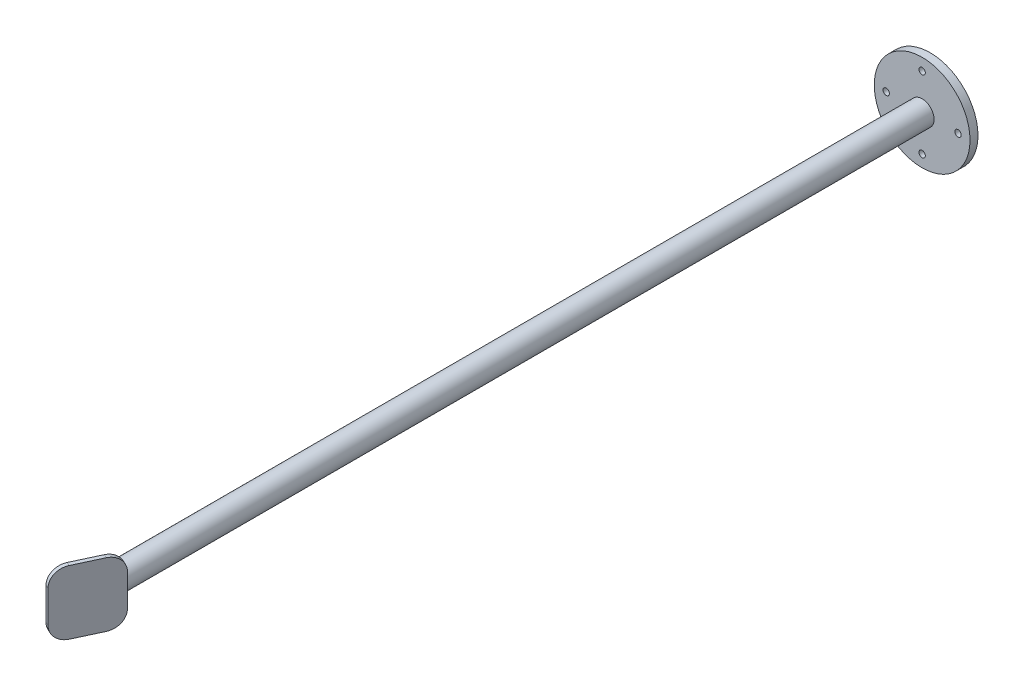
ISO-10303-21;
HEADER;
FILE_DESCRIPTION(('STEP AP214'),'2;1');
FILE_NAME('part.step','',(''),(''),'','','');
FILE_SCHEMA(('AUTOMOTIVE_DESIGN { 1 0 10303 214 1 1 1 1 }'));
ENDSEC;
DATA;
#1=APPLICATION_CONTEXT('core data for automotive mechanical design processes');
#2=APPLICATION_PROTOCOL_DEFINITION('international standard','automotive_design',2000,#1);
#3=PRODUCT_CONTEXT('',#1,'mechanical');
#4=PRODUCT('Part','Part','',(#3));
#5=PRODUCT_RELATED_PRODUCT_CATEGORY('part','',(#4));
#6=PRODUCT_DEFINITION_FORMATION('','',#4);
#7=PRODUCT_DEFINITION_CONTEXT('part definition',#1,'design');
#8=PRODUCT_DEFINITION('design','',#6,#7);
#9=PRODUCT_DEFINITION_SHAPE('','',#8);
#10=(LENGTH_UNIT() NAMED_UNIT(*) SI_UNIT(.MILLI.,.METRE.));
#11=(NAMED_UNIT(*) PLANE_ANGLE_UNIT() SI_UNIT($,.RADIAN.));
#12=(NAMED_UNIT(*) SI_UNIT($,.STERADIAN.) SOLID_ANGLE_UNIT());
#13=UNCERTAINTY_MEASURE_WITH_UNIT(LENGTH_MEASURE(1.E-05),#10,'distance_accuracy_value','');
#14=(GEOMETRIC_REPRESENTATION_CONTEXT(3) GLOBAL_UNCERTAINTY_ASSIGNED_CONTEXT((#13)) GLOBAL_UNIT_ASSIGNED_CONTEXT((#10,
#11,#12)) REPRESENTATION_CONTEXT('',''));
#15=CARTESIAN_POINT('',(0.,0.,0.));
#16=DIRECTION('',(0.,0.,1.));
#17=DIRECTION('',(1.,0.,0.));
#18=AXIS2_PLACEMENT_3D('',#15,#16,#17);
#19=CARTESIAN_POINT('',(0.,0.,10.));
#20=DIRECTION('',(0.,0.,1.));
#21=DIRECTION('',(1.,0.,0.));
#22=AXIS2_PLACEMENT_3D('',#19,#20,#21);
#23=PLANE('',#22);
#24=CARTESIAN_POINT('',(0.,0.,10.));
#25=DIRECTION('',(0.,0.,1.));
#26=DIRECTION('',(1.,0.,0.));
#27=AXIS2_PLACEMENT_3D('',#24,#25,#26);
#28=CIRCLE('',#27,15.);
#29=CARTESIAN_POINT('',(15.,0.,10.));
#30=VERTEX_POINT('',#29);
#31=EDGE_CURVE('E163',#30,#30,#28,.T.);
#32=ORIENTED_EDGE('',*,*,#31,.F.);
#33=EDGE_LOOP('',(#32));
#34=FACE_BOUND('',#33,.T.);
#35=CARTESIAN_POINT('',(0.,-45.,10.));
#36=DIRECTION('',(0.,0.,1.));
#37=DIRECTION('',(1.,0.,0.));
#38=AXIS2_PLACEMENT_3D('',#35,#36,#37);
#39=CIRCLE('',#38,4.);
#40=CARTESIAN_POINT('',(4.00000000000001,-45.,10.));
#41=VERTEX_POINT('',#40);
#42=EDGE_CURVE('E173',#41,#41,#39,.T.);
#43=ORIENTED_EDGE('',*,*,#42,.F.);
#44=EDGE_LOOP('',(#43));
#45=FACE_BOUND('',#44,.T.);
#46=CARTESIAN_POINT('',(0.,45.,10.));
#47=DIRECTION('',(0.,0.,1.));
#48=DIRECTION('',(1.,0.,0.));
#49=AXIS2_PLACEMENT_3D('',#46,#47,#48);
#50=CIRCLE('',#49,4.);
#51=CARTESIAN_POINT('',(4.,45.,10.));
#52=VERTEX_POINT('',#51);
#53=EDGE_CURVE('E185',#52,#52,#50,.T.);
#54=ORIENTED_EDGE('',*,*,#53,.F.);
#55=EDGE_LOOP('',(#54));
#56=FACE_BOUND('',#55,.T.);
#57=CARTESIAN_POINT('',(0.,0.,10.));
#58=DIRECTION('',(0.,0.,1.));
#59=DIRECTION('',(1.,0.,0.));
#60=AXIS2_PLACEMENT_3D('',#57,#58,#59);
#61=CIRCLE('',#60,60.);
#62=CARTESIAN_POINT('',(60.,0.,10.));
#63=VERTEX_POINT('',#62);
#64=EDGE_CURVE('E11',#63,#63,#61,.T.);
#65=ORIENTED_EDGE('',*,*,#64,.T.);
#66=EDGE_LOOP('',(#65));
#67=FACE_BOUND('',#66,.T.);
#68=CARTESIAN_POINT('',(45.,0.,10.));
#69=DIRECTION('',(0.,0.,1.));
#70=DIRECTION('',(1.,0.,0.));
#71=AXIS2_PLACEMENT_3D('',#68,#69,#70);
#72=CIRCLE('',#71,4.00000000000001);
#73=CARTESIAN_POINT('',(49.,0.,10.));
#74=VERTEX_POINT('',#73);
#75=EDGE_CURVE('E179',#74,#74,#72,.T.);
#76=ORIENTED_EDGE('',*,*,#75,.F.);
#77=EDGE_LOOP('',(#76));
#78=FACE_BOUND('',#77,.T.);
#79=CARTESIAN_POINT('',(-45.,0.,10.));
#80=DIRECTION('',(0.,0.,1.));
#81=DIRECTION('',(1.,0.,0.));
#82=AXIS2_PLACEMENT_3D('',#79,#80,#81);
#83=CIRCLE('',#82,4.00000000000001);
#84=CARTESIAN_POINT('',(-41.,0.,10.));
#85=VERTEX_POINT('',#84);
#86=EDGE_CURVE('E167',#85,#85,#83,.T.);
#87=ORIENTED_EDGE('',*,*,#86,.F.);
#88=EDGE_LOOP('',(#87));
#89=FACE_BOUND('',#88,.T.);
#90=ADVANCED_FACE('F33',(#34,#45,#56,#67,#78,#89),#23,.T.);
#91=CARTESIAN_POINT('',(0.,0.,0.));
#92=DIRECTION('',(0.,0.,1.));
#93=DIRECTION('',(1.,0.,0.));
#94=AXIS2_PLACEMENT_3D('',#91,#92,#93);
#95=PLANE('',#94);
#96=CARTESIAN_POINT('',(0.,0.,0.));
#97=DIRECTION('',(0.,0.,1.));
#98=DIRECTION('',(1.,0.,0.));
#99=AXIS2_PLACEMENT_3D('',#96,#97,#98);
#100=CIRCLE('',#99,60.);
#101=CARTESIAN_POINT('',(60.,0.,0.));
#102=VERTEX_POINT('',#101);
#103=EDGE_CURVE('E37',#102,#102,#100,.T.);
#104=ORIENTED_EDGE('',*,*,#103,.F.);
#105=EDGE_LOOP('',(#104));
#106=FACE_BOUND('',#105,.T.);
#107=CARTESIAN_POINT('',(0.,45.,0.));
#108=DIRECTION('',(0.,0.,1.));
#109=DIRECTION('',(1.,0.,0.));
#110=AXIS2_PLACEMENT_3D('',#107,#108,#109);
#111=CIRCLE('',#110,4.);
#112=CARTESIAN_POINT('',(4.,45.,0.));
#113=VERTEX_POINT('',#112);
#114=EDGE_CURVE('E182',#113,#113,#111,.T.);
#115=ORIENTED_EDGE('',*,*,#114,.T.);
#116=EDGE_LOOP('',(#115));
#117=FACE_BOUND('',#116,.T.);
#118=CARTESIAN_POINT('',(45.,0.,0.));
#119=DIRECTION('',(0.,0.,1.));
#120=DIRECTION('',(1.,0.,0.));
#121=AXIS2_PLACEMENT_3D('',#118,#119,#120);
#122=CIRCLE('',#121,4.00000000000001);
#123=CARTESIAN_POINT('',(49.,0.,0.));
#124=VERTEX_POINT('',#123);
#125=EDGE_CURVE('E176',#124,#124,#122,.T.);
#126=ORIENTED_EDGE('',*,*,#125,.T.);
#127=EDGE_LOOP('',(#126));
#128=FACE_BOUND('',#127,.T.);
#129=CARTESIAN_POINT('',(0.,-45.,0.));
#130=DIRECTION('',(0.,0.,1.));
#131=DIRECTION('',(1.,0.,0.));
#132=AXIS2_PLACEMENT_3D('',#129,#130,#131);
#133=CIRCLE('',#132,4.);
#134=CARTESIAN_POINT('',(4.00000000000001,-45.,0.));
#135=VERTEX_POINT('',#134);
#136=EDGE_CURVE('E170',#135,#135,#133,.T.);
#137=ORIENTED_EDGE('',*,*,#136,.T.);
#138=EDGE_LOOP('',(#137));
#139=FACE_BOUND('',#138,.T.);
#140=CARTESIAN_POINT('',(-45.,0.,0.));
#141=DIRECTION('',(0.,0.,1.));
#142=DIRECTION('',(1.,0.,0.));
#143=AXIS2_PLACEMENT_3D('',#140,#141,#142);
#144=CIRCLE('',#143,4.00000000000001);
#145=CARTESIAN_POINT('',(-41.,0.,0.));
#146=VERTEX_POINT('',#145);
#147=EDGE_CURVE('E166',#146,#146,#144,.T.);
#148=ORIENTED_EDGE('',*,*,#147,.T.);
#149=EDGE_LOOP('',(#148));
#150=FACE_BOUND('',#149,.T.);
#151=ADVANCED_FACE('F191',(#106,#117,#128,#139,#150),#95,.F.);
#152=CARTESIAN_POINT('',(0.,0.,10.));
#153=DIRECTION('',(0.,0.,-1.));
#154=DIRECTION('',(-1.,0.,0.));
#155=AXIS2_PLACEMENT_3D('',#152,#153,#154);
#156=CYLINDRICAL_SURFACE('',#155,60.);
#157=ORIENTED_EDGE('',*,*,#64,.F.);
#158=EDGE_LOOP('',(#157));
#159=FACE_BOUND('',#158,.T.);
#160=ORIENTED_EDGE('',*,*,#103,.T.);
#161=EDGE_LOOP('',(#160));
#162=FACE_BOUND('',#161,.T.);
#163=ADVANCED_FACE('F35',(#159,#162),#156,.T.);
#164=CARTESIAN_POINT('',(0.,45.,10.));
#165=DIRECTION('',(0.,0.,-1.));
#166=DIRECTION('',(-1.,0.,0.));
#167=AXIS2_PLACEMENT_3D('',#164,#165,#166);
#168=CYLINDRICAL_SURFACE('',#167,4.);
#169=ORIENTED_EDGE('',*,*,#53,.T.);
#170=EDGE_LOOP('',(#169));
#171=FACE_BOUND('',#170,.T.);
#172=ORIENTED_EDGE('',*,*,#114,.F.);
#173=EDGE_LOOP('',(#172));
#174=FACE_BOUND('',#173,.T.);
#175=ADVANCED_FACE('F194',(#171,#174),#168,.F.);
#176=CARTESIAN_POINT('',(45.,0.,10.));
#177=DIRECTION('',(0.,0.,-1.));
#178=DIRECTION('',(-1.,0.,0.));
#179=AXIS2_PLACEMENT_3D('',#176,#177,#178);
#180=CYLINDRICAL_SURFACE('',#179,4.00000000000001);
#181=ORIENTED_EDGE('',*,*,#75,.T.);
#182=EDGE_LOOP('',(#181));
#183=FACE_BOUND('',#182,.T.);
#184=ORIENTED_EDGE('',*,*,#125,.F.);
#185=EDGE_LOOP('',(#184));
#186=FACE_BOUND('',#185,.T.);
#187=ADVANCED_FACE('F196',(#183,#186),#180,.F.);
#188=CARTESIAN_POINT('',(0.,-45.,10.));
#189=DIRECTION('',(0.,0.,-1.));
#190=DIRECTION('',(-1.,0.,0.));
#191=AXIS2_PLACEMENT_3D('',#188,#189,#190);
#192=CYLINDRICAL_SURFACE('',#191,4.);
#193=ORIENTED_EDGE('',*,*,#42,.T.);
#194=EDGE_LOOP('',(#193));
#195=FACE_BOUND('',#194,.T.);
#196=ORIENTED_EDGE('',*,*,#136,.F.);
#197=EDGE_LOOP('',(#196));
#198=FACE_BOUND('',#197,.T.);
#199=ADVANCED_FACE('F203',(#195,#198),#192,.F.);
#200=CARTESIAN_POINT('',(-45.,0.,10.));
#201=DIRECTION('',(0.,0.,-1.));
#202=DIRECTION('',(-1.,0.,0.));
#203=AXIS2_PLACEMENT_3D('',#200,#201,#202);
#204=CYLINDRICAL_SURFACE('',#203,4.00000000000001);
#205=ORIENTED_EDGE('',*,*,#86,.T.);
#206=EDGE_LOOP('',(#205));
#207=FACE_BOUND('',#206,.T.);
#208=ORIENTED_EDGE('',*,*,#147,.F.);
#209=EDGE_LOOP('',(#208));
#210=FACE_BOUND('',#209,.T.);
#211=ADVANCED_FACE('F226',(#207,#210),#204,.F.);
#212=CARTESIAN_POINT('',(0.,0.,1090.));
#213=DIRECTION('',(0.,0.,-1.));
#214=DIRECTION('',(-1.,0.,0.));
#215=AXIS2_PLACEMENT_3D('',#212,#213,#214);
#216=CYLINDRICAL_SURFACE('',#215,15.);
#217=CARTESIAN_POINT('',(0.,0.,1057.83239619236));
#218=DIRECTION('',(-0.906307787036651,0.,-0.422618261740697));
#219=DIRECTION('',(0.422618261740697,0.,-0.906307787036651));
#220=AXIS2_PLACEMENT_3D('',#217,#218,#219);
#221=ELLIPSE('',#220,35.4930237472876,15.);
#222=CARTESIAN_POINT('',(15.,0.,1025.66479238471));
#223=VERTEX_POINT('',#222);
#224=EDGE_CURVE('E160',#223,#223,#221,.F.);
#225=ORIENTED_EDGE('',*,*,#224,.F.);
#226=EDGE_LOOP('',(#225));
#227=FACE_BOUND('',#226,.T.);
#228=ORIENTED_EDGE('',*,*,#31,.T.);
#229=EDGE_LOOP('',(#228));
#230=FACE_BOUND('',#229,.T.);
#231=ADVANCED_FACE('F229',(#227,#230),#216,.T.);
#232=CARTESIAN_POINT('',(-2.86428064527562,20.,1075.8058737742));
#233=DIRECTION('',(-0.906307787036651,0.,-0.422618261740697));
#234=DIRECTION('',(-0.422618261740697,0.,0.906307787036651));
#235=AXIS2_PLACEMENT_3D('',#232,#233,#234);
#236=CYLINDRICAL_SURFACE('',#235,19.9999999999999);
#237=CARTESIAN_POINT('',(-7.39581958045887,20.,1073.69278246549));
#238=DIRECTION('',(0.906307787036651,0.,0.422618261740697));
#239=DIRECTION('',(0.422618261740697,0.,-0.906307787036651));
#240=AXIS2_PLACEMENT_3D('',#237,#238,#239);
#241=CIRCLE('',#240,19.9999999999999);
#242=CARTESIAN_POINT('',(-7.39581958045887,40.,1073.69278246549));
#243=VERTEX_POINT('',#242);
#244=CARTESIAN_POINT('',(-15.8481848152728,20.,1091.81893820623));
#245=VERTEX_POINT('',#244);
#246=EDGE_CURVE('E131',#243,#245,#241,.T.);
#247=ORIENTED_EDGE('',*,*,#246,.T.);
#248=DIRECTION('',(-0.906307787036651,0.,-0.422618261740697));
#249=VECTOR('',#248,1.);
#250=CARTESIAN_POINT('',(-11.3166458800896,20.,1093.93202951493));
#251=LINE('',#250,#249);
#252=CARTESIAN_POINT('',(-11.3166458800896,20.,1093.93202951493));
#253=VERTEX_POINT('',#252);
#254=EDGE_CURVE('E158',#253,#245,#251,.T.);
#255=ORIENTED_EDGE('',*,*,#254,.F.);
#256=CARTESIAN_POINT('',(-2.86428064527562,20.,1075.8058737742));
#257=DIRECTION('',(0.906307787036651,0.,0.422618261740697));
#258=DIRECTION('',(0.422618261740697,0.,-0.906307787036651));
#259=AXIS2_PLACEMENT_3D('',#256,#257,#258);
#260=CIRCLE('',#259,19.9999999999999);
#261=CARTESIAN_POINT('',(-2.86428064527562,40.,1075.8058737742));
#262=VERTEX_POINT('',#261);
#263=EDGE_CURVE('E145',#262,#253,#260,.T.);
#264=ORIENTED_EDGE('',*,*,#263,.F.);
#265=DIRECTION('',(-0.906307787036651,0.,-0.422618261740697));
#266=VECTOR('',#265,1.);
#267=CARTESIAN_POINT('',(-2.86428064527562,40.,1075.8058737742));
#268=LINE('',#267,#266);
#269=EDGE_CURVE('E127',#262,#243,#268,.T.);
#270=ORIENTED_EDGE('',*,*,#269,.T.);
#271=EDGE_LOOP('',(#247,#255,#264,#270));
#272=FACE_BOUND('',#271,.T.);
#273=ADVANCED_FACE('F237',(#272),#236,.T.);
#274=CARTESIAN_POINT('',(-11.3166458800896,-20.,1093.93202951493));
#275=DIRECTION('',(0.422618261740697,0.,-0.906307787036651));
#276=DIRECTION('',(-0.906307787036651,0.,-0.422618261740697));
#277=AXIS2_PLACEMENT_3D('',#274,#275,#276);
#278=PLANE('',#277);
#279=DIRECTION('',(0.,-1.,0.));
#280=VECTOR('',#279,1.);
#281=CARTESIAN_POINT('',(-15.8481848152728,-20.,1091.81893820623));
#282=LINE('',#281,#280);
#283=CARTESIAN_POINT('',(-15.8481848152728,-20.,1091.81893820623));
#284=VERTEX_POINT('',#283);
#285=EDGE_CURVE('E134',#245,#284,#282,.T.);
#286=ORIENTED_EDGE('',*,*,#285,.T.);
#287=DIRECTION('',(-0.906307787036651,0.,-0.422618261740697));
#288=VECTOR('',#287,1.);
#289=CARTESIAN_POINT('',(-11.3166458800895,-20.,1093.93202951493));
#290=LINE('',#289,#288);
#291=CARTESIAN_POINT('',(-11.3166458800895,-20.,1093.93202951493));
#292=VERTEX_POINT('',#291);
#293=EDGE_CURVE('E155',#292,#284,#290,.T.);
#294=ORIENTED_EDGE('',*,*,#293,.F.);
#295=DIRECTION('',(0.,-1.,0.));
#296=VECTOR('',#295,1.);
#297=CARTESIAN_POINT('',(-11.3166458800896,-20.,1093.93202951493));
#298=LINE('',#297,#296);
#299=EDGE_CURVE('E94',#253,#292,#298,.T.);
#300=ORIENTED_EDGE('',*,*,#299,.F.);
#301=ORIENTED_EDGE('',*,*,#254,.T.);
#302=EDGE_LOOP('',(#286,#294,#300,#301));
#303=FACE_BOUND('',#302,.T.);
#304=ADVANCED_FACE('F245',(#303),#278,.F.);
#305=CARTESIAN_POINT('',(-2.86428064527562,-20.,1075.8058737742));
#306=DIRECTION('',(-0.906307787036651,0.,-0.422618261740697));
#307=DIRECTION('',(-0.422618261740697,0.,0.906307787036651));
#308=AXIS2_PLACEMENT_3D('',#305,#306,#307);
#309=CYLINDRICAL_SURFACE('',#308,19.9999999999999);
#310=CARTESIAN_POINT('',(-7.39581958045887,-20.,1073.69278246549));
#311=DIRECTION('',(0.906307787036651,0.,0.422618261740697));
#312=DIRECTION('',(-0.422618261740697,0.,0.906307787036651));
#313=AXIS2_PLACEMENT_3D('',#310,#311,#312);
#314=CIRCLE('',#313,19.9999999999999);
#315=CARTESIAN_POINT('',(-7.39581958045887,-40.,1073.69278246549));
#316=VERTEX_POINT('',#315);
#317=EDGE_CURVE('E136',#284,#316,#314,.T.);
#318=ORIENTED_EDGE('',*,*,#317,.T.);
#319=DIRECTION('',(-0.906307787036651,0.,-0.422618261740697));
#320=VECTOR('',#319,1.);
#321=CARTESIAN_POINT('',(-2.86428064527562,-40.,1075.8058737742));
#322=LINE('',#321,#320);
#323=CARTESIAN_POINT('',(-2.86428064527562,-40.,1075.8058737742));
#324=VERTEX_POINT('',#323);
#325=EDGE_CURVE('E152',#324,#316,#322,.T.);
#326=ORIENTED_EDGE('',*,*,#325,.F.);
#327=CARTESIAN_POINT('',(-2.86428064527562,-20.,1075.8058737742));
#328=DIRECTION('',(0.906307787036651,0.,0.422618261740697));
#329=DIRECTION('',(-0.422618261740697,0.,0.906307787036651));
#330=AXIS2_PLACEMENT_3D('',#327,#328,#329);
#331=CIRCLE('',#330,19.9999999999999);
#332=EDGE_CURVE('E382',#292,#324,#331,.T.);
#333=ORIENTED_EDGE('',*,*,#332,.F.);
#334=ORIENTED_EDGE('',*,*,#293,.T.);
#335=EDGE_LOOP('',(#318,#326,#333,#334));
#336=FACE_BOUND('',#335,.T.);
#337=ADVANCED_FACE('F249',(#336),#309,.T.);
#338=CARTESIAN_POINT('',(11.9273585156487,-40.,1044.08510122791));
#339=DIRECTION('',(0.,1.,0.));
#340=DIRECTION('',(0.,0.,1.));
#341=AXIS2_PLACEMENT_3D('',#338,#339,#340);
#342=PLANE('',#341);
#343=DIRECTION('',(0.422618261740695,0.,-0.906307787036652));
#344=VECTOR('',#343,1.);
#345=CARTESIAN_POINT('',(7.39581958046548,-40.,1041.97200991921));
#346=LINE('',#345,#344);
#347=CARTESIAN_POINT('',(7.39581958046548,-39.9999999999999,1041.97200991921));
#348=VERTEX_POINT('',#347);
#349=EDGE_CURVE('E138',#316,#348,#346,.T.);
#350=ORIENTED_EDGE('',*,*,#349,.T.);
#351=DIRECTION('',(-0.906307787036651,0.,-0.422618261740697));
#352=VECTOR('',#351,1.);
#353=CARTESIAN_POINT('',(11.9273585156487,-39.9999999999999,1044.08510122791));
#354=LINE('',#353,#352);
#355=CARTESIAN_POINT('',(11.9273585156487,-39.9999999999999,1044.08510122791));
#356=VERTEX_POINT('',#355);
#357=EDGE_CURVE('E149',#356,#348,#354,.T.);
#358=ORIENTED_EDGE('',*,*,#357,.F.);
#359=DIRECTION('',(0.422618261740695,0.,-0.906307787036652));
#360=VECTOR('',#359,1.);
#361=CARTESIAN_POINT('',(11.9273585156487,-40.,1044.08510122791));
#362=LINE('',#361,#360);
#363=EDGE_CURVE('E386',#324,#356,#362,.T.);
#364=ORIENTED_EDGE('',*,*,#363,.F.);
#365=ORIENTED_EDGE('',*,*,#325,.T.);
#366=EDGE_LOOP('',(#350,#358,#364,#365));
#367=FACE_BOUND('',#366,.T.);
#368=ADVANCED_FACE('F252',(#367),#342,.F.);
#369=CARTESIAN_POINT('',(11.9273585156487,-20.,1044.08510122791));
#370=DIRECTION('',(-0.906307787036651,0.,-0.422618261740697));
#371=DIRECTION('',(-0.422618261740697,0.,0.906307787036651));
#372=AXIS2_PLACEMENT_3D('',#369,#370,#371);
#373=CYLINDRICAL_SURFACE('',#372,19.9999999999999);
#374=CARTESIAN_POINT('',(7.39581958046548,-20.,1041.97200991921));
#375=DIRECTION('',(0.906307787036651,0.,0.422618261740697));
#376=DIRECTION('',(0.422618261740697,0.,-0.906307787036651));
#377=AXIS2_PLACEMENT_3D('',#374,#375,#376);
#378=CIRCLE('',#377,19.9999999999999);
#379=CARTESIAN_POINT('',(15.8481848152794,-20.,1023.84585417848));
#380=VERTEX_POINT('',#379);
#381=EDGE_CURVE('E140',#348,#380,#378,.T.);
#382=ORIENTED_EDGE('',*,*,#381,.T.);
#383=DIRECTION('',(-0.906307787036651,0.,-0.422618261740697));
#384=VECTOR('',#383,1.);
#385=CARTESIAN_POINT('',(20.3797237504627,-20.,1025.95894548718));
#386=LINE('',#385,#384);
#387=CARTESIAN_POINT('',(20.3797237504627,-20.,1025.95894548718));
#388=VERTEX_POINT('',#387);
#389=EDGE_CURVE('E122',#388,#380,#386,.T.);
#390=ORIENTED_EDGE('',*,*,#389,.F.);
#391=CARTESIAN_POINT('',(11.9273585156487,-20.,1044.08510122791));
#392=DIRECTION('',(0.906307787036651,0.,0.422618261740697));
#393=DIRECTION('',(0.422618261740697,0.,-0.906307787036651));
#394=AXIS2_PLACEMENT_3D('',#391,#392,#393);
#395=CIRCLE('',#394,19.9999999999999);
#396=EDGE_CURVE('E113',#356,#388,#395,.T.);
#397=ORIENTED_EDGE('',*,*,#396,.F.);
#398=ORIENTED_EDGE('',*,*,#357,.T.);
#399=EDGE_LOOP('',(#382,#390,#397,#398));
#400=FACE_BOUND('',#399,.T.);
#401=ADVANCED_FACE('F256',(#400),#373,.T.);
#402=CARTESIAN_POINT('',(20.3797237504627,-20.,1025.95894548718));
#403=DIRECTION('',(-0.422618261740697,0.,0.906307787036651));
#404=DIRECTION('',(0.906307787036651,0.,0.422618261740697));
#405=AXIS2_PLACEMENT_3D('',#402,#403,#404);
#406=PLANE('',#405);
#407=DIRECTION('',(0.,1.,0.));
#408=VECTOR('',#407,1.);
#409=CARTESIAN_POINT('',(15.8481848152794,-20.,1023.84585417848));
#410=LINE('',#409,#408);
#411=CARTESIAN_POINT('',(15.8481848152794,20.,1023.84585417848));
#412=VERTEX_POINT('',#411);
#413=EDGE_CURVE('E121',#380,#412,#410,.T.);
#414=ORIENTED_EDGE('',*,*,#413,.T.);
#415=DIRECTION('',(-0.906307787036651,0.,-0.422618261740697));
#416=VECTOR('',#415,1.);
#417=CARTESIAN_POINT('',(20.3797237504627,20.,1025.95894548718));
#418=LINE('',#417,#416);
#419=CARTESIAN_POINT('',(20.3797237504627,20.,1025.95894548718));
#420=VERTEX_POINT('',#419);
#421=EDGE_CURVE('E118',#420,#412,#418,.T.);
#422=ORIENTED_EDGE('',*,*,#421,.F.);
#423=DIRECTION('',(0.,1.,0.));
#424=VECTOR('',#423,1.);
#425=CARTESIAN_POINT('',(20.3797237504627,-20.,1025.95894548718));
#426=LINE('',#425,#424);
#427=EDGE_CURVE('E107',#388,#420,#426,.T.);
#428=ORIENTED_EDGE('',*,*,#427,.F.);
#429=ORIENTED_EDGE('',*,*,#389,.T.);
#430=EDGE_LOOP('',(#414,#422,#428,#429));
#431=FACE_BOUND('',#430,.T.);
#432=ADVANCED_FACE('F119',(#431),#406,.F.);
#433=CARTESIAN_POINT('',(11.9273585156487,20.,1044.08510122791));
#434=DIRECTION('',(-0.906307787036651,0.,-0.422618261740697));
#435=DIRECTION('',(-0.422618261740697,0.,0.906307787036651));
#436=AXIS2_PLACEMENT_3D('',#433,#434,#435);
#437=CYLINDRICAL_SURFACE('',#436,20.);
#438=CARTESIAN_POINT('',(7.39581958046548,20.,1041.97200991921));
#439=DIRECTION('',(0.906307787036651,0.,0.422618261740697));
#440=DIRECTION('',(0.422618261740697,0.,-0.906307787036651));
#441=AXIS2_PLACEMENT_3D('',#438,#439,#440);
#442=CIRCLE('',#441,20.);
#443=CARTESIAN_POINT('',(7.39581958046548,40.,1041.97200991921));
#444=VERTEX_POINT('',#443);
#445=EDGE_CURVE('E79',#412,#444,#442,.T.);
#446=ORIENTED_EDGE('',*,*,#445,.T.);
#447=DIRECTION('',(-0.906307787036651,0.,-0.422618261740697));
#448=VECTOR('',#447,1.);
#449=CARTESIAN_POINT('',(11.9273585156487,40.,1044.08510122791));
#450=LINE('',#449,#448);
#451=CARTESIAN_POINT('',(11.9273585156487,40.,1044.08510122791));
#452=VERTEX_POINT('',#451);
#453=EDGE_CURVE('E123',#452,#444,#450,.T.);
#454=ORIENTED_EDGE('',*,*,#453,.F.);
#455=CARTESIAN_POINT('',(11.9273585156487,20.,1044.08510122791));
#456=DIRECTION('',(0.906307787036651,0.,0.422618261740697));
#457=DIRECTION('',(0.422618261740697,0.,-0.906307787036651));
#458=AXIS2_PLACEMENT_3D('',#455,#456,#457);
#459=CIRCLE('',#458,20.);
#460=EDGE_CURVE('E111',#420,#452,#459,.T.);
#461=ORIENTED_EDGE('',*,*,#460,.F.);
#462=ORIENTED_EDGE('',*,*,#421,.T.);
#463=EDGE_LOOP('',(#446,#454,#461,#462));
#464=FACE_BOUND('',#463,.T.);
#465=ADVANCED_FACE('F125',(#464),#437,.T.);
#466=CARTESIAN_POINT('',(11.9273585156487,40.,1044.08510122791));
#467=DIRECTION('',(0.,-1.,0.));
#468=DIRECTION('',(0.,0.,-1.));
#469=AXIS2_PLACEMENT_3D('',#466,#467,#468);
#470=PLANE('',#469);
#471=DIRECTION('',(-0.422618261740695,0.,0.906307787036652));
#472=VECTOR('',#471,1.);
#473=CARTESIAN_POINT('',(7.39581958046548,40.,1041.97200991921));
#474=LINE('',#473,#472);
#475=EDGE_CURVE('E85',#444,#243,#474,.T.);
#476=ORIENTED_EDGE('',*,*,#475,.T.);
#477=ORIENTED_EDGE('',*,*,#269,.F.);
#478=DIRECTION('',(-0.422618261740695,0.,0.906307787036652));
#479=VECTOR('',#478,1.);
#480=CARTESIAN_POINT('',(11.9273585156487,40.,1044.08510122791));
#481=LINE('',#480,#479);
#482=EDGE_CURVE('E50',#452,#262,#481,.T.);
#483=ORIENTED_EDGE('',*,*,#482,.F.);
#484=ORIENTED_EDGE('',*,*,#453,.T.);
#485=EDGE_LOOP('',(#476,#477,#483,#484));
#486=FACE_BOUND('',#485,.T.);
#487=ADVANCED_FACE('F265',(#486),#470,.F.);
#488=CARTESIAN_POINT('',(-2.86428064527562,20.,1075.8058737742));
#489=DIRECTION('',(0.906307787036651,0.,0.422618261740697));
#490=DIRECTION('',(0.422618261740697,0.,-0.906307787036651));
#491=AXIS2_PLACEMENT_3D('',#488,#489,#490);
#492=PLANE('',#491);
#493=ORIENTED_EDGE('',*,*,#263,.T.);
#494=ORIENTED_EDGE('',*,*,#299,.T.);
#495=ORIENTED_EDGE('',*,*,#332,.T.);
#496=ORIENTED_EDGE('',*,*,#363,.T.);
#497=ORIENTED_EDGE('',*,*,#396,.T.);
#498=ORIENTED_EDGE('',*,*,#427,.T.);
#499=ORIENTED_EDGE('',*,*,#460,.T.);
#500=ORIENTED_EDGE('',*,*,#482,.T.);
#501=EDGE_LOOP('',(#493,#494,#495,#496,#497,#498,#499,#500));
#502=FACE_BOUND('',#501,.T.);
#503=ADVANCED_FACE('F109',(#502),#492,.T.);
#504=CARTESIAN_POINT('',(-7.39581958045887,20.,1073.69278246549));
#505=DIRECTION('',(0.906307787036651,0.,0.422618261740697));
#506=DIRECTION('',(0.422618261740697,0.,-0.906307787036651));
#507=AXIS2_PLACEMENT_3D('',#504,#505,#506);
#508=PLANE('',#507);
#509=ORIENTED_EDGE('',*,*,#224,.T.);
#510=EDGE_LOOP('',(#509));
#511=FACE_BOUND('',#510,.T.);
#512=ORIENTED_EDGE('',*,*,#246,.F.);
#513=ORIENTED_EDGE('',*,*,#475,.F.);
#514=ORIENTED_EDGE('',*,*,#445,.F.);
#515=ORIENTED_EDGE('',*,*,#413,.F.);
#516=ORIENTED_EDGE('',*,*,#381,.F.);
#517=ORIENTED_EDGE('',*,*,#349,.F.);
#518=ORIENTED_EDGE('',*,*,#317,.F.);
#519=ORIENTED_EDGE('',*,*,#285,.F.);
#520=EDGE_LOOP('',(#512,#513,#514,#515,#516,#517,#518,#519));
#521=FACE_BOUND('',#520,.T.);
#522=ADVANCED_FACE('F268',(#511,#521),#508,.F.);
#523=CLOSED_SHELL('',(#90,#151,#163,#175,#187,#199,#211,#231,#273,#304,#337,#368,#401,#432,#465,
#487,#503,#522));
#524=MANIFOLD_SOLID_BREP('B2',#523);
#525=ADVANCED_BREP_SHAPE_REPRESENTATION('',(#18,#524),#14);
#526=SHAPE_DEFINITION_REPRESENTATION(#9,#525);
ENDSEC;
END-ISO-10303-21;
